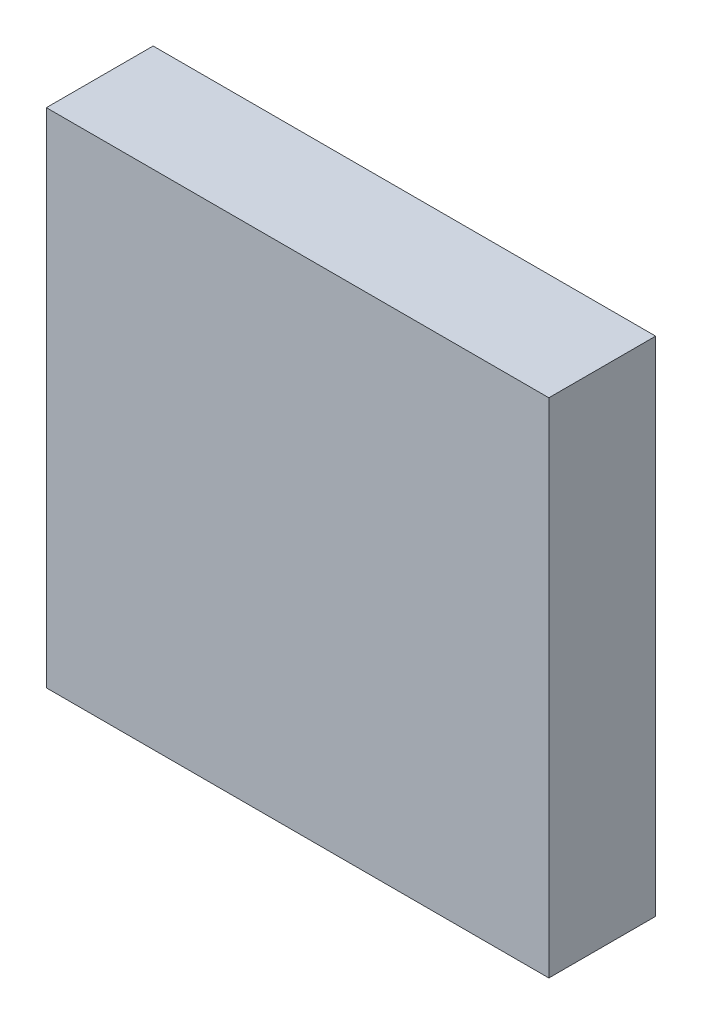
ISO-10303-21;
HEADER;
FILE_DESCRIPTION(('STEP AP214'),'2;1');
FILE_NAME('part.step','',(''),(''),'','','');
FILE_SCHEMA(('AUTOMOTIVE_DESIGN { 1 0 10303 214 1 1 1 1 }'));
ENDSEC;
DATA;
#1=APPLICATION_CONTEXT('core data for automotive mechanical design processes');
#2=APPLICATION_PROTOCOL_DEFINITION('international standard','automotive_design',2000,#1);
#3=PRODUCT_CONTEXT('',#1,'mechanical');
#4=PRODUCT('Part','Part','',(#3));
#5=PRODUCT_RELATED_PRODUCT_CATEGORY('part','',(#4));
#6=PRODUCT_DEFINITION_FORMATION('','',#4);
#7=PRODUCT_DEFINITION_CONTEXT('part definition',#1,'design');
#8=PRODUCT_DEFINITION('design','',#6,#7);
#9=PRODUCT_DEFINITION_SHAPE('','',#8);
#10=(LENGTH_UNIT() NAMED_UNIT(*) SI_UNIT(.MILLI.,.METRE.));
#11=(NAMED_UNIT(*) PLANE_ANGLE_UNIT() SI_UNIT($,.RADIAN.));
#12=(NAMED_UNIT(*) SI_UNIT($,.STERADIAN.) SOLID_ANGLE_UNIT());
#13=UNCERTAINTY_MEASURE_WITH_UNIT(LENGTH_MEASURE(1.E-05),#10,'distance_accuracy_value','');
#14=(GEOMETRIC_REPRESENTATION_CONTEXT(3) GLOBAL_UNCERTAINTY_ASSIGNED_CONTEXT((#13)) GLOBAL_UNIT_ASSIGNED_CONTEXT((#10,
#11,#12)) REPRESENTATION_CONTEXT('',''));
#15=CARTESIAN_POINT('',(0.,0.,0.));
#16=DIRECTION('',(0.,0.,1.));
#17=DIRECTION('',(1.,0.,0.));
#18=AXIS2_PLACEMENT_3D('',#15,#16,#17);
#19=CARTESIAN_POINT('',(-4.,-4.,1.7));
#20=DIRECTION('',(1.,0.,0.));
#21=DIRECTION('',(0.,0.,-1.));
#22=AXIS2_PLACEMENT_3D('',#19,#20,#21);
#23=PLANE('',#22);
#24=DIRECTION('',(0.,-1.,0.));
#25=VECTOR('',#24,1.);
#26=CARTESIAN_POINT('',(-4.,-4.,0.));
#27=LINE('',#26,#25);
#28=CARTESIAN_POINT('',(-4.,4.,0.));
#29=VERTEX_POINT('',#28);
#30=CARTESIAN_POINT('',(-4.,-4.,0.));
#31=VERTEX_POINT('',#30);
#32=EDGE_CURVE('E74',#29,#31,#27,.T.);
#33=ORIENTED_EDGE('',*,*,#32,.T.);
#34=DIRECTION('',(0.,0.,-1.));
#35=VECTOR('',#34,1.);
#36=CARTESIAN_POINT('',(-4.,-4.,1.7));
#37=LINE('',#36,#35);
#38=CARTESIAN_POINT('',(-4.,-4.,1.7));
#39=VERTEX_POINT('',#38);
#40=EDGE_CURVE('E11',#39,#31,#37,.T.);
#41=ORIENTED_EDGE('',*,*,#40,.F.);
#42=DIRECTION('',(0.,-1.,0.));
#43=VECTOR('',#42,1.);
#44=CARTESIAN_POINT('',(-4.,3.2,1.7));
#45=LINE('',#44,#43);
#46=CARTESIAN_POINT('',(-4.,4.,1.7));
#47=VERTEX_POINT('',#46);
#48=EDGE_CURVE('E79',#47,#39,#45,.T.);
#49=ORIENTED_EDGE('',*,*,#48,.F.);
#50=DIRECTION('',(0.,0.,-1.));
#51=VECTOR('',#50,1.);
#52=CARTESIAN_POINT('',(-4.,4.,1.7));
#53=LINE('',#52,#51);
#54=EDGE_CURVE('E94',#47,#29,#53,.T.);
#55=ORIENTED_EDGE('',*,*,#54,.T.);
#56=EDGE_LOOP('',(#33,#41,#49,#55));
#57=FACE_BOUND('',#56,.T.);
#58=ADVANCED_FACE('F34',(#57),#23,.F.);
#59=CARTESIAN_POINT('',(4.,-4.,1.7));
#60=DIRECTION('',(0.,1.,0.));
#61=DIRECTION('',(0.,0.,1.));
#62=AXIS2_PLACEMENT_3D('',#59,#60,#61);
#63=PLANE('',#62);
#64=DIRECTION('',(1.,0.,0.));
#65=VECTOR('',#64,1.);
#66=CARTESIAN_POINT('',(4.,-4.,0.));
#67=LINE('',#66,#65);
#68=CARTESIAN_POINT('',(4.,-4.,0.));
#69=VERTEX_POINT('',#68);
#70=EDGE_CURVE('E90',#31,#69,#67,.T.);
#71=ORIENTED_EDGE('',*,*,#70,.T.);
#72=DIRECTION('',(0.,0.,-1.));
#73=VECTOR('',#72,1.);
#74=CARTESIAN_POINT('',(4.,-4.,1.7));
#75=LINE('',#74,#73);
#76=CARTESIAN_POINT('',(4.,-4.,1.7));
#77=VERTEX_POINT('',#76);
#78=EDGE_CURVE('E42',#77,#69,#75,.T.);
#79=ORIENTED_EDGE('',*,*,#78,.F.);
#80=DIRECTION('',(1.,0.,0.));
#81=VECTOR('',#80,1.);
#82=CARTESIAN_POINT('',(4.,-4.,1.7));
#83=LINE('',#82,#81);
#84=EDGE_CURVE('E82',#39,#77,#83,.T.);
#85=ORIENTED_EDGE('',*,*,#84,.F.);
#86=ORIENTED_EDGE('',*,*,#40,.T.);
#87=EDGE_LOOP('',(#71,#79,#85,#86));
#88=FACE_BOUND('',#87,.T.);
#89=ADVANCED_FACE('F89',(#88),#63,.F.);
#90=CARTESIAN_POINT('',(4.,4.,1.7));
#91=DIRECTION('',(-1.,0.,0.));
#92=DIRECTION('',(0.,0.,1.));
#93=AXIS2_PLACEMENT_3D('',#90,#91,#92);
#94=PLANE('',#93);
#95=DIRECTION('',(0.,1.,0.));
#96=VECTOR('',#95,1.);
#97=CARTESIAN_POINT('',(4.,4.,0.));
#98=LINE('',#97,#96);
#99=CARTESIAN_POINT('',(4.,4.,0.));
#100=VERTEX_POINT('',#99);
#101=EDGE_CURVE('E67',#69,#100,#98,.T.);
#102=ORIENTED_EDGE('',*,*,#101,.T.);
#103=DIRECTION('',(0.,0.,-1.));
#104=VECTOR('',#103,1.);
#105=CARTESIAN_POINT('',(4.,4.,1.7));
#106=LINE('',#105,#104);
#107=CARTESIAN_POINT('',(4.,4.,1.7));
#108=VERTEX_POINT('',#107);
#109=EDGE_CURVE('E91',#108,#100,#106,.T.);
#110=ORIENTED_EDGE('',*,*,#109,.F.);
#111=DIRECTION('',(0.,1.,0.));
#112=VECTOR('',#111,1.);
#113=CARTESIAN_POINT('',(4.,4.,1.7));
#114=LINE('',#113,#112);
#115=EDGE_CURVE('E86',#77,#108,#114,.T.);
#116=ORIENTED_EDGE('',*,*,#115,.F.);
#117=ORIENTED_EDGE('',*,*,#78,.T.);
#118=EDGE_LOOP('',(#102,#110,#116,#117));
#119=FACE_BOUND('',#118,.T.);
#120=ADVANCED_FACE('F92',(#119),#94,.F.);
#121=CARTESIAN_POINT('',(-4.,4.,1.7));
#122=DIRECTION('',(0.,-1.,0.));
#123=DIRECTION('',(0.,0.,-1.));
#124=AXIS2_PLACEMENT_3D('',#121,#122,#123);
#125=PLANE('',#124);
#126=DIRECTION('',(-1.,0.,0.));
#127=VECTOR('',#126,1.);
#128=CARTESIAN_POINT('',(-4.,4.,0.));
#129=LINE('',#128,#127);
#130=EDGE_CURVE('E101',#100,#29,#129,.T.);
#131=ORIENTED_EDGE('',*,*,#130,.T.);
#132=ORIENTED_EDGE('',*,*,#54,.F.);
#133=DIRECTION('',(-1.,0.,0.));
#134=VECTOR('',#133,1.);
#135=CARTESIAN_POINT('',(-4.,4.,1.7));
#136=LINE('',#135,#134);
#137=EDGE_CURVE('E50',#108,#47,#136,.T.);
#138=ORIENTED_EDGE('',*,*,#137,.F.);
#139=ORIENTED_EDGE('',*,*,#109,.T.);
#140=EDGE_LOOP('',(#131,#132,#138,#139));
#141=FACE_BOUND('',#140,.T.);
#142=ADVANCED_FACE('F106',(#141),#125,.F.);
#143=CARTESIAN_POINT('',(0.,0.,1.7));
#144=DIRECTION('',(0.,0.,-1.));
#145=DIRECTION('',(-1.,0.,0.));
#146=AXIS2_PLACEMENT_3D('',#143,#144,#145);
#147=PLANE('',#146);
#148=ORIENTED_EDGE('',*,*,#48,.T.);
#149=ORIENTED_EDGE('',*,*,#84,.T.);
#150=ORIENTED_EDGE('',*,*,#115,.T.);
#151=ORIENTED_EDGE('',*,*,#137,.T.);
#152=EDGE_LOOP('',(#148,#149,#150,#151));
#153=FACE_BOUND('',#152,.T.);
#154=ADVANCED_FACE('F84',(#153),#147,.F.);
#155=CARTESIAN_POINT('',(0.,0.,0.));
#156=DIRECTION('',(0.,0.,-1.));
#157=DIRECTION('',(-1.,0.,0.));
#158=AXIS2_PLACEMENT_3D('',#155,#156,#157);
#159=PLANE('',#158);
#160=ORIENTED_EDGE('',*,*,#32,.F.);
#161=ORIENTED_EDGE('',*,*,#130,.F.);
#162=ORIENTED_EDGE('',*,*,#101,.F.);
#163=ORIENTED_EDGE('',*,*,#70,.F.);
#164=EDGE_LOOP('',(#160,#161,#162,#163));
#165=FACE_BOUND('',#164,.T.);
#166=ADVANCED_FACE('F107',(#165),#159,.T.);
#167=CLOSED_SHELL('',(#58,#89,#120,#142,#154,#166));
#168=MANIFOLD_SOLID_BREP('B2',#167);
#169=ADVANCED_BREP_SHAPE_REPRESENTATION('',(#18,#168),#14);
#170=SHAPE_DEFINITION_REPRESENTATION(#9,#169);
ENDSEC;
END-ISO-10303-21;
